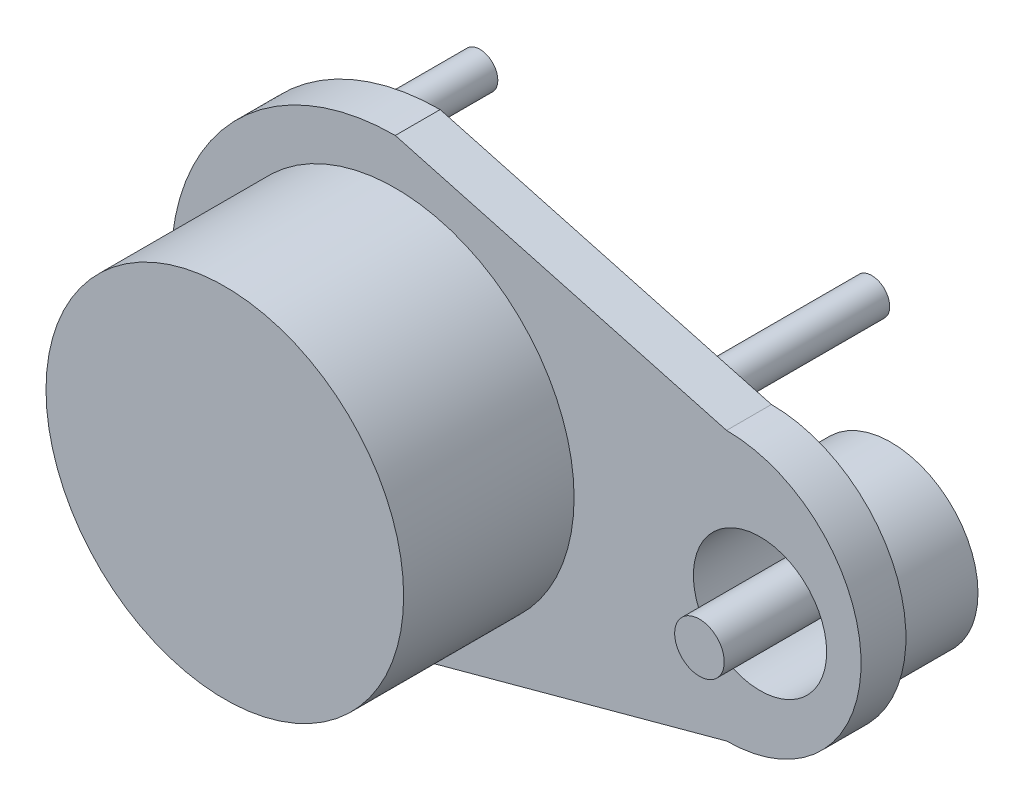
ISO-10303-21;
HEADER;
FILE_DESCRIPTION(('STEP AP214'),'2;1');
FILE_NAME('part.step','',(''),(''),'','','');
FILE_SCHEMA(('AUTOMOTIVE_DESIGN { 1 0 10303 214 1 1 1 1 }'));
ENDSEC;
DATA;
#1=APPLICATION_CONTEXT('core data for automotive mechanical design processes');
#2=APPLICATION_PROTOCOL_DEFINITION('international standard','automotive_design',2000,#1);
#3=PRODUCT_CONTEXT('',#1,'mechanical');
#4=PRODUCT('Part','Part','',(#3));
#5=PRODUCT_RELATED_PRODUCT_CATEGORY('part','',(#4));
#6=PRODUCT_DEFINITION_FORMATION('','',#4);
#7=PRODUCT_DEFINITION_CONTEXT('part definition',#1,'design');
#8=PRODUCT_DEFINITION('design','',#6,#7);
#9=PRODUCT_DEFINITION_SHAPE('','',#8);
#10=(LENGTH_UNIT() NAMED_UNIT(*) SI_UNIT(.MILLI.,.METRE.));
#11=(NAMED_UNIT(*) PLANE_ANGLE_UNIT() SI_UNIT($,.RADIAN.));
#12=(NAMED_UNIT(*) SI_UNIT($,.STERADIAN.) SOLID_ANGLE_UNIT());
#13=UNCERTAINTY_MEASURE_WITH_UNIT(LENGTH_MEASURE(1.E-05),#10,'distance_accuracy_value','');
#14=(GEOMETRIC_REPRESENTATION_CONTEXT(3) GLOBAL_UNCERTAINTY_ASSIGNED_CONTEXT((#13)) GLOBAL_UNIT_ASSIGNED_CONTEXT((#10,
#11,#12)) REPRESENTATION_CONTEXT('',''));
#15=CARTESIAN_POINT('',(0.,0.,0.));
#16=DIRECTION('',(0.,0.,1.));
#17=DIRECTION('',(1.,0.,0.));
#18=AXIS2_PLACEMENT_3D('',#15,#16,#17);
#19=CARTESIAN_POINT('',(6.13606220537989,-0.0739210601489247,1.8));
#20=DIRECTION('',(0.,0.,-1.));
#21=DIRECTION('',(-1.,0.,0.));
#22=AXIS2_PLACEMENT_3D('',#19,#20,#21);
#23=CYLINDRICAL_SURFACE('',#22,0.414358546564722);
#24=CARTESIAN_POINT('',(6.13606220537989,-0.0739210601489247,1.8));
#25=DIRECTION('',(0.,0.,-1.));
#26=DIRECTION('',(1.,0.,0.));
#27=AXIS2_PLACEMENT_3D('',#24,#25,#26);
#28=CIRCLE('',#27,0.414358546564722);
#29=CARTESIAN_POINT('',(6.55042075194461,-0.0739210601489247,1.8));
#30=VERTEX_POINT('',#29);
#31=EDGE_CURVE('E11',#30,#30,#28,.T.);
#32=ORIENTED_EDGE('',*,*,#31,.T.);
#33=EDGE_LOOP('',(#32));
#34=FACE_BOUND('',#33,.T.);
#35=CARTESIAN_POINT('',(6.13606220537989,-0.0739210601489247,0.));
#36=DIRECTION('',(0.,0.,-1.));
#37=DIRECTION('',(1.,0.,0.));
#38=AXIS2_PLACEMENT_3D('',#35,#36,#37);
#39=CIRCLE('',#38,0.414358546564722);
#40=CARTESIAN_POINT('',(6.55042075194461,-0.0739210601489247,0.));
#41=VERTEX_POINT('',#40);
#42=EDGE_CURVE('E50',#41,#41,#39,.T.);
#43=ORIENTED_EDGE('',*,*,#42,.F.);
#44=EDGE_LOOP('',(#43));
#45=FACE_BOUND('',#44,.T.);
#46=ADVANCED_FACE('F47',(#34,#45),#23,.T.);
#47=CARTESIAN_POINT('',(6.13606220537989,-0.0739210601489247,1.8));
#48=DIRECTION('',(0.,0.,1.));
#49=DIRECTION('',(1.,0.,0.));
#50=AXIS2_PLACEMENT_3D('',#47,#48,#49);
#51=PLANE('',#50);
#52=ORIENTED_EDGE('',*,*,#31,.F.);
#53=EDGE_LOOP('',(#52));
#54=FACE_BOUND('',#53,.T.);
#55=ADVANCED_FACE('F62',(#54),#51,.T.);
#56=CARTESIAN_POINT('',(6.13606220537989,-0.0739210601489247,0.));
#57=DIRECTION('',(0.,0.,1.));
#58=DIRECTION('',(1.,0.,0.));
#59=AXIS2_PLACEMENT_3D('',#56,#57,#58);
#60=PLANE('',#59);
#61=ORIENTED_EDGE('',*,*,#42,.T.);
#62=EDGE_LOOP('',(#61));
#63=FACE_BOUND('',#62,.T.);
#64=ADVANCED_FACE('F59',(#63),#60,.F.);
#65=CLOSED_SHELL('',(#46,#55,#64));
#66=MANIFOLD_SOLID_BREP('B2',#65);
#67=CARTESIAN_POINT('',(0.,0.,0.));
#68=DIRECTION('',(0.,0.,1.));
#69=DIRECTION('',(1.,0.,0.));
#70=AXIS2_PLACEMENT_3D('',#67,#68,#69);
#71=CYLINDRICAL_SURFACE('',#70,3.75);
#72=CARTESIAN_POINT('',(0.,0.,0.75));
#73=DIRECTION('',(0.,0.,1.));
#74=DIRECTION('',(1.,0.,0.));
#75=AXIS2_PLACEMENT_3D('',#72,#73,#74);
#76=CIRCLE('',#75,3.75);
#77=CARTESIAN_POINT('',(0.,3.75,0.75));
#78=VERTEX_POINT('',#77);
#79=CARTESIAN_POINT('',(0.,-3.75,0.75));
#80=VERTEX_POINT('',#79);
#81=EDGE_CURVE('E162',#78,#80,#76,.T.);
#82=ORIENTED_EDGE('',*,*,#81,.F.);
#83=DIRECTION('',(0.,0.,1.));
#84=VECTOR('',#83,1.);
#85=CARTESIAN_POINT('',(0.,3.75,0.));
#86=LINE('',#85,#84);
#87=CARTESIAN_POINT('',(0.,3.75,0.));
#88=VERTEX_POINT('',#87);
#89=EDGE_CURVE('E105',#88,#78,#86,.T.);
#90=ORIENTED_EDGE('',*,*,#89,.F.);
#91=CARTESIAN_POINT('',(0.,0.,0.));
#92=DIRECTION('',(0.,0.,1.));
#93=DIRECTION('',(1.,0.,0.));
#94=AXIS2_PLACEMENT_3D('',#91,#92,#93);
#95=CIRCLE('',#94,3.75);
#96=CARTESIAN_POINT('',(0.,-3.75,0.));
#97=VERTEX_POINT('',#96);
#98=EDGE_CURVE('E153',#88,#97,#95,.T.);
#99=ORIENTED_EDGE('',*,*,#98,.T.);
#100=DIRECTION('',(0.,0.,1.));
#101=VECTOR('',#100,1.);
#102=CARTESIAN_POINT('',(0.,-3.75,0.));
#103=LINE('',#102,#101);
#104=EDGE_CURVE('E133',#97,#80,#103,.T.);
#105=ORIENTED_EDGE('',*,*,#104,.T.);
#106=EDGE_LOOP('',(#82,#90,#99,#105));
#107=FACE_BOUND('',#106,.T.);
#108=ADVANCED_FACE('F88',(#107),#71,.T.);
#109=CARTESIAN_POINT('',(5.53928342735173,2.24917212989785,0.));
#110=DIRECTION('',(0.261513733941694,0.965199754952245,0.));
#111=DIRECTION('',(-0.965199754952245,0.261513733941694,0.));
#112=AXIS2_PLACEMENT_3D('',#109,#110,#111);
#113=PLANE('',#112);
#114=DIRECTION('',(-0.965199754952245,0.261513733941694,0.));
#115=VECTOR('',#114,1.);
#116=CARTESIAN_POINT('',(5.53928342735173,2.24917212989785,0.75));
#117=LINE('',#116,#115);
#118=CARTESIAN_POINT('',(5.53928342735173,2.24917212989785,0.75));
#119=VERTEX_POINT('',#118);
#120=EDGE_CURVE('E156',#119,#78,#117,.T.);
#121=ORIENTED_EDGE('',*,*,#120,.F.);
#122=DIRECTION('',(0.,0.,1.));
#123=VECTOR('',#122,1.);
#124=CARTESIAN_POINT('',(5.53928342735173,2.24917212989785,0.));
#125=LINE('',#124,#123);
#126=CARTESIAN_POINT('',(5.53928342735173,2.24917212989785,0.));
#127=VERTEX_POINT('',#126);
#128=EDGE_CURVE('E122',#127,#119,#125,.T.);
#129=ORIENTED_EDGE('',*,*,#128,.F.);
#130=DIRECTION('',(-0.965199754952245,0.261513733941694,0.));
#131=VECTOR('',#130,1.);
#132=CARTESIAN_POINT('',(5.53928342735173,2.24917212989785,0.));
#133=LINE('',#132,#131);
#134=EDGE_CURVE('E148',#127,#88,#133,.T.);
#135=ORIENTED_EDGE('',*,*,#134,.T.);
#136=ORIENTED_EDGE('',*,*,#89,.T.);
#137=EDGE_LOOP('',(#121,#129,#135,#136));
#138=FACE_BOUND('',#137,.T.);
#139=ADVANCED_FACE('F225',(#138),#113,.T.);
#140=CARTESIAN_POINT('',(5.53928342735173,0.,0.));
#141=DIRECTION('',(0.,0.,1.));
#142=DIRECTION('',(1.,0.,0.));
#143=AXIS2_PLACEMENT_3D('',#140,#141,#142);
#144=CYLINDRICAL_SURFACE('',#143,2.24917212989785);
#145=CARTESIAN_POINT('',(5.53928342735173,0.,0.75));
#146=DIRECTION('',(0.,0.,1.));
#147=DIRECTION('',(1.,0.,0.));
#148=AXIS2_PLACEMENT_3D('',#145,#146,#147);
#149=CIRCLE('',#148,2.24917212989785);
#150=CARTESIAN_POINT('',(5.53928342735173,-2.24917212989785,0.75));
#151=VERTEX_POINT('',#150);
#152=EDGE_CURVE('E141',#151,#119,#149,.T.);
#153=ORIENTED_EDGE('',*,*,#152,.F.);
#154=DIRECTION('',(0.,0.,1.));
#155=VECTOR('',#154,1.);
#156=CARTESIAN_POINT('',(5.53928342735173,-2.24917212989785,0.));
#157=LINE('',#156,#155);
#158=CARTESIAN_POINT('',(5.53928342735173,-2.24917212989785,0.));
#159=VERTEX_POINT('',#158);
#160=EDGE_CURVE('E136',#159,#151,#157,.T.);
#161=ORIENTED_EDGE('',*,*,#160,.F.);
#162=CARTESIAN_POINT('',(5.53928342735173,0.,0.));
#163=DIRECTION('',(0.,0.,1.));
#164=DIRECTION('',(1.,0.,0.));
#165=AXIS2_PLACEMENT_3D('',#162,#163,#164);
#166=CIRCLE('',#165,2.24917212989785);
#167=EDGE_CURVE('E139',#159,#127,#166,.T.);
#168=ORIENTED_EDGE('',*,*,#167,.T.);
#169=ORIENTED_EDGE('',*,*,#128,.T.);
#170=EDGE_LOOP('',(#153,#161,#168,#169));
#171=FACE_BOUND('',#170,.T.);
#172=ADVANCED_FACE('F138',(#171),#144,.T.);
#173=CARTESIAN_POINT('',(0.,-3.75,0.));
#174=DIRECTION('',(0.261513733941694,-0.965199754952245,0.));
#175=DIRECTION('',(0.965199754952245,0.261513733941694,0.));
#176=AXIS2_PLACEMENT_3D('',#173,#174,#175);
#177=PLANE('',#176);
#178=DIRECTION('',(0.965199754952245,0.261513733941694,0.));
#179=VECTOR('',#178,1.);
#180=CARTESIAN_POINT('',(0.,-3.75,0.75));
#181=LINE('',#180,#179);
#182=EDGE_CURVE('E166',#80,#151,#181,.T.);
#183=ORIENTED_EDGE('',*,*,#182,.F.);
#184=ORIENTED_EDGE('',*,*,#104,.F.);
#185=DIRECTION('',(0.965199754952245,0.261513733941694,0.));
#186=VECTOR('',#185,1.);
#187=CARTESIAN_POINT('',(0.,-3.75,0.));
#188=LINE('',#187,#186);
#189=EDGE_CURVE('E147',#97,#159,#188,.T.);
#190=ORIENTED_EDGE('',*,*,#189,.T.);
#191=ORIENTED_EDGE('',*,*,#160,.T.);
#192=EDGE_LOOP('',(#183,#184,#190,#191));
#193=FACE_BOUND('',#192,.T.);
#194=ADVANCED_FACE('F151',(#193),#177,.T.);
#195=CARTESIAN_POINT('',(0.,0.,0.));
#196=DIRECTION('',(0.,0.,1.));
#197=DIRECTION('',(1.,0.,0.));
#198=AXIS2_PLACEMENT_3D('',#195,#196,#197);
#199=PLANE('',#198);
#200=CARTESIAN_POINT('',(-2.33550033845928,1.65606157665012,0.));
#201=DIRECTION('',(0.,0.,1.));
#202=DIRECTION('',(1.,0.,0.));
#203=AXIS2_PLACEMENT_3D('',#200,#201,#202);
#204=CIRCLE('',#203,0.3);
#205=CARTESIAN_POINT('',(-2.03550033845928,1.65606157665012,0.));
#206=VERTEX_POINT('',#205);
#207=EDGE_CURVE('E45',#206,#206,#204,.F.);
#208=ORIENTED_EDGE('',*,*,#207,.F.);
#209=EDGE_LOOP('',(#208));
#210=FACE_BOUND('',#209,.T.);
#211=CARTESIAN_POINT('',(4.21700322835852,1.65606157665012,0.));
#212=DIRECTION('',(0.,0.,1.));
#213=DIRECTION('',(1.,0.,0.));
#214=AXIS2_PLACEMENT_3D('',#211,#212,#213);
#215=CIRCLE('',#214,0.3);
#216=CARTESIAN_POINT('',(4.51700322835852,1.65606157665012,0.));
#217=VERTEX_POINT('',#216);
#218=EDGE_CURVE('E97',#217,#217,#215,.F.);
#219=ORIENTED_EDGE('',*,*,#218,.F.);
#220=EDGE_LOOP('',(#219));
#221=FACE_BOUND('',#220,.T.);
#222=CARTESIAN_POINT('',(-2.32214505937726,-1.19392531452417,0.));
#223=DIRECTION('',(0.,0.,1.));
#224=DIRECTION('',(1.,0.,0.));
#225=AXIS2_PLACEMENT_3D('',#222,#223,#224);
#226=CIRCLE('',#225,0.3);
#227=CARTESIAN_POINT('',(-2.02214505937726,-1.19392531452417,0.));
#228=VERTEX_POINT('',#227);
#229=EDGE_CURVE('E189',#228,#228,#226,.F.);
#230=ORIENTED_EDGE('',*,*,#229,.F.);
#231=EDGE_LOOP('',(#230));
#232=FACE_BOUND('',#231,.T.);
#233=CARTESIAN_POINT('',(4.19412788257281,-1.19392531452417,0.));
#234=DIRECTION('',(0.,0.,1.));
#235=DIRECTION('',(1.,0.,0.));
#236=AXIS2_PLACEMENT_3D('',#233,#234,#235);
#237=CIRCLE('',#236,0.3);
#238=CARTESIAN_POINT('',(4.49412788257281,-1.19392531452417,0.));
#239=VERTEX_POINT('',#238);
#240=EDGE_CURVE('E185',#239,#239,#237,.F.);
#241=ORIENTED_EDGE('',*,*,#240,.F.);
#242=EDGE_LOOP('',(#241));
#243=FACE_BOUND('',#242,.T.);
#244=CARTESIAN_POINT('',(6.18990300181641,-0.101269822445856,0.));
#245=DIRECTION('',(0.,0.,1.));
#246=DIRECTION('',(1.,0.,0.));
#247=AXIS2_PLACEMENT_3D('',#244,#245,#246);
#248=CIRCLE('',#247,1.45351980451713);
#249=CARTESIAN_POINT('',(7.64342280633354,-0.101269822445856,0.));
#250=VERTEX_POINT('',#249);
#251=EDGE_CURVE('E177',#250,#250,#248,.F.);
#252=ORIENTED_EDGE('',*,*,#251,.F.);
#253=EDGE_LOOP('',(#252));
#254=FACE_BOUND('',#253,.T.);
#255=ORIENTED_EDGE('',*,*,#98,.F.);
#256=ORIENTED_EDGE('',*,*,#134,.F.);
#257=ORIENTED_EDGE('',*,*,#167,.F.);
#258=ORIENTED_EDGE('',*,*,#189,.F.);
#259=EDGE_LOOP('',(#255,#256,#257,#258));
#260=FACE_BOUND('',#259,.T.);
#261=ADVANCED_FACE('F146',(#210,#221,#232,#243,#254,#260),#199,.F.);
#262=CARTESIAN_POINT('',(0.,0.,0.75));
#263=DIRECTION('',(0.,0.,1.));
#264=DIRECTION('',(1.,0.,0.));
#265=AXIS2_PLACEMENT_3D('',#262,#263,#264);
#266=PLANE('',#265);
#267=CARTESIAN_POINT('',(0.,0.,0.75));
#268=DIRECTION('',(0.,0.,-1.));
#269=DIRECTION('',(-1.,0.,0.));
#270=AXIS2_PLACEMENT_3D('',#267,#268,#269);
#271=CIRCLE('',#270,2.98996803252256);
#272=CARTESIAN_POINT('',(-2.98996803252256,0.,0.75));
#273=VERTEX_POINT('',#272);
#274=EDGE_CURVE('E351',#273,#273,#271,.T.);
#275=ORIENTED_EDGE('',*,*,#274,.T.);
#276=EDGE_LOOP('',(#275));
#277=FACE_BOUND('',#276,.T.);
#278=CARTESIAN_POINT('',(6.0987585846147,-0.125150984462153,0.750000000000001));
#279=DIRECTION('',(0.,0.,1.));
#280=DIRECTION('',(1.,0.,0.));
#281=AXIS2_PLACEMENT_3D('',#278,#279,#280);
#282=CIRCLE('',#281,1.11410504022745);
#283=CARTESIAN_POINT('',(7.21286362484215,-0.125150984462153,0.750000000000001));
#284=VERTEX_POINT('',#283);
#285=EDGE_CURVE('E321',#284,#284,#282,.T.);
#286=ORIENTED_EDGE('',*,*,#285,.F.);
#287=EDGE_LOOP('',(#286));
#288=FACE_BOUND('',#287,.T.);
#289=ORIENTED_EDGE('',*,*,#81,.T.);
#290=ORIENTED_EDGE('',*,*,#182,.T.);
#291=ORIENTED_EDGE('',*,*,#152,.T.);
#292=ORIENTED_EDGE('',*,*,#120,.T.);
#293=EDGE_LOOP('',(#289,#290,#291,#292));
#294=FACE_BOUND('',#293,.T.);
#295=ADVANCED_FACE('F200',(#277,#288,#294),#266,.T.);
#296=CARTESIAN_POINT('',(6.18990300181641,-0.101269822445856,-1.35));
#297=DIRECTION('',(0.,0.,1.));
#298=DIRECTION('',(1.,0.,0.));
#299=AXIS2_PLACEMENT_3D('',#296,#297,#298);
#300=CYLINDRICAL_SURFACE('',#299,1.45351980451713);
#301=CARTESIAN_POINT('',(6.18990300181641,-0.101269822445856,-1.35));
#302=DIRECTION('',(0.,0.,-1.));
#303=DIRECTION('',(-1.,0.,0.));
#304=AXIS2_PLACEMENT_3D('',#301,#302,#303);
#305=CIRCLE('',#304,1.45351980451713);
#306=CARTESIAN_POINT('',(7.64342280633354,-0.101269822445856,-1.35));
#307=VERTEX_POINT('',#306);
#308=EDGE_CURVE('E167',#307,#307,#305,.T.);
#309=CARTESIAN_POINT('',(7.64342280633354,-0.101269822445856,-1.35));
#310=CARTESIAN_POINT('',(7.64342280633354,-0.101269822445856,-1.3359375));
#311=CARTESIAN_POINT('',(7.64342280633354,-0.101269822445856,-1.321875));
#312=CARTESIAN_POINT('',(7.64342280633354,-0.101269822445856,-1.29375));
#313=CARTESIAN_POINT('',(7.64342280633354,-0.101269822445856,-1.2796875));
#314=CARTESIAN_POINT('',(7.64342280633354,-0.101269822445856,-1.2515625));
#315=CARTESIAN_POINT('',(7.64342280633354,-0.101269822445856,-1.2375));
#316=CARTESIAN_POINT('',(7.64342280633354,-0.101269822445856,-1.209375));
#317=CARTESIAN_POINT('',(7.64342280633354,-0.101269822445856,-1.1953125));
#318=CARTESIAN_POINT('',(7.64342280633354,-0.101269822445856,-1.1671875));
#319=CARTESIAN_POINT('',(7.64342280633354,-0.101269822445856,-1.153125));
#320=CARTESIAN_POINT('',(7.64342280633354,-0.101269822445856,-1.125));
#321=CARTESIAN_POINT('',(7.64342280633354,-0.101269822445856,-1.1109375));
#322=CARTESIAN_POINT('',(7.64342280633354,-0.101269822445856,-1.0828125));
#323=CARTESIAN_POINT('',(7.64342280633354,-0.101269822445856,-1.06875));
#324=CARTESIAN_POINT('',(7.64342280633354,-0.101269822445856,-1.040625));
#325=CARTESIAN_POINT('',(7.64342280633354,-0.101269822445856,-1.0265625));
#326=CARTESIAN_POINT('',(7.64342280633354,-0.101269822445856,-0.9984375));
#327=CARTESIAN_POINT('',(7.64342280633354,-0.101269822445856,-0.984375));
#328=CARTESIAN_POINT('',(7.64342280633354,-0.101269822445856,-0.95625));
#329=CARTESIAN_POINT('',(7.64342280633354,-0.101269822445856,-0.9421875));
#330=CARTESIAN_POINT('',(7.64342280633354,-0.101269822445856,-0.9140625));
#331=CARTESIAN_POINT('',(7.64342280633354,-0.101269822445856,-0.9));
#332=CARTESIAN_POINT('',(7.64342280633354,-0.101269822445856,-0.871875));
#333=CARTESIAN_POINT('',(7.64342280633354,-0.101269822445856,-0.8578125));
#334=CARTESIAN_POINT('',(7.64342280633354,-0.101269822445856,-0.8296875));
#335=CARTESIAN_POINT('',(7.64342280633354,-0.101269822445856,-0.815625));
#336=CARTESIAN_POINT('',(7.64342280633354,-0.101269822445856,-0.7875));
#337=CARTESIAN_POINT('',(7.64342280633354,-0.101269822445856,-0.7734375));
#338=CARTESIAN_POINT('',(7.64342280633354,-0.101269822445856,-0.7453125));
#339=CARTESIAN_POINT('',(7.64342280633354,-0.101269822445856,-0.73125));
#340=CARTESIAN_POINT('',(7.64342280633354,-0.101269822445856,-0.703125));
#341=CARTESIAN_POINT('',(7.64342280633354,-0.101269822445856,-0.6890625));
#342=CARTESIAN_POINT('',(7.64342280633354,-0.101269822445856,-0.6609375));
#343=CARTESIAN_POINT('',(7.64342280633354,-0.101269822445856,-0.646875));
#344=CARTESIAN_POINT('',(7.64342280633354,-0.101269822445856,-0.61875));
#345=CARTESIAN_POINT('',(7.64342280633354,-0.101269822445856,-0.6046875));
#346=CARTESIAN_POINT('',(7.64342280633354,-0.101269822445856,-0.5765625));
#347=CARTESIAN_POINT('',(7.64342280633354,-0.101269822445856,-0.5625));
#348=CARTESIAN_POINT('',(7.64342280633354,-0.101269822445856,-0.534375));
#349=CARTESIAN_POINT('',(7.64342280633354,-0.101269822445856,-0.5203125));
#350=CARTESIAN_POINT('',(7.64342280633354,-0.101269822445856,-0.4921875));
#351=CARTESIAN_POINT('',(7.64342280633354,-0.101269822445856,-0.478125));
#352=CARTESIAN_POINT('',(7.64342280633354,-0.101269822445856,-0.45));
#353=CARTESIAN_POINT('',(7.64342280633354,-0.101269822445856,-0.4359375));
#354=CARTESIAN_POINT('',(7.64342280633354,-0.101269822445856,-0.4078125));
#355=CARTESIAN_POINT('',(7.64342280633354,-0.101269822445856,-0.39375));
#356=CARTESIAN_POINT('',(7.64342280633354,-0.101269822445856,-0.365625));
#357=CARTESIAN_POINT('',(7.64342280633354,-0.101269822445856,-0.3515625));
#358=CARTESIAN_POINT('',(7.64342280633354,-0.101269822445856,-0.3234375));
#359=CARTESIAN_POINT('',(7.64342280633354,-0.101269822445856,-0.309375));
#360=CARTESIAN_POINT('',(7.64342280633354,-0.101269822445856,-0.28125));
#361=CARTESIAN_POINT('',(7.64342280633354,-0.101269822445856,-0.2671875));
#362=CARTESIAN_POINT('',(7.64342280633354,-0.101269822445856,-0.2390625));
#363=CARTESIAN_POINT('',(7.64342280633354,-0.101269822445856,-0.225));
#364=CARTESIAN_POINT('',(7.64342280633354,-0.101269822445856,-0.196875));
#365=CARTESIAN_POINT('',(7.64342280633354,-0.101269822445856,-0.1828125));
#366=CARTESIAN_POINT('',(7.64342280633354,-0.101269822445856,-0.1546875));
#367=CARTESIAN_POINT('',(7.64342280633354,-0.101269822445856,-0.140625));
#368=CARTESIAN_POINT('',(7.64342280633354,-0.101269822445856,-0.1125));
#369=CARTESIAN_POINT('',(7.64342280633354,-0.101269822445856,-0.0984375000000002));
#370=CARTESIAN_POINT('',(7.64342280633354,-0.101269822445856,-0.0703125000000002));
#371=CARTESIAN_POINT('',(7.64342280633354,-0.101269822445856,-0.0562500000000002));
#372=CARTESIAN_POINT('',(7.64342280633354,-0.101269822445856,-0.0281250000000002));
#373=CARTESIAN_POINT('',(7.64342280633354,-0.101269822445856,-0.0140625000000002));
#374=CARTESIAN_POINT('',(7.64342280633354,-0.101269822445856,0.));
#375=B_SPLINE_CURVE_WITH_KNOTS('',3,(#309,#310,#311,#312,#313,#314,#315,#316,#317,#318,#319,
#320,#321,#322,#323,#324,#325,#326,#327,#328,#329,#330,#331,#332,#333,#334,#335,#336,#337,#338,
#339,#340,#341,#342,#343,#344,#345,#346,#347,#348,#349,#350,#351,#352,#353,#354,#355,#356,#357,
#358,#359,#360,#361,#362,#363,#364,#365,#366,#367,#368,#369,#370,#371,#372,#373,#374),
.UNSPECIFIED.,.F.,.F.,(4,2,2,2,2,2,2,2,2,2,2,2,2,2,2,2,2,2,2,2,2,2,2,2,2,2,2,2,2,2,2,2,4),(0.,
0.0421874999999999,0.0843749999999998,0.1265625,0.16875,0.2109375,0.253125,0.2953125,0.3375,
0.3796875,0.421875,0.4640625,0.50625,0.5484375,0.590625,0.6328125,0.675,0.7171875,0.759375,
0.8015625,0.84375,0.8859375,0.928125,0.9703125,1.0125,1.0546875,1.096875,1.1390625,1.18125,
1.2234375,1.265625,1.3078125,1.35),.UNSPECIFIED.);
#376=EDGE_CURVE('BSEAM209',#307,#250,#375,.T.);
#377=ORIENTED_EDGE('',*,*,#308,.F.);
#378=ORIENTED_EDGE('',*,*,#251,.T.);
#379=ORIENTED_EDGE('',*,*,#376,.T.);
#380=ORIENTED_EDGE('',*,*,#376,.F.);
#381=EDGE_LOOP('',(#377,#379,#378,#380));
#382=FACE_BOUND('',#381,.T.);
#383=ADVANCED_FACE('F209',(#382),#300,.T.);
#384=CARTESIAN_POINT('',(6.18990300181641,-0.101269822445856,-1.35));
#385=DIRECTION('',(0.,0.,-1.));
#386=DIRECTION('',(-1.,0.,0.));
#387=AXIS2_PLACEMENT_3D('',#384,#385,#386);
#388=PLANE('',#387);
#389=CARTESIAN_POINT('',(6.0987585846147,-0.125150984462153,-1.35));
#390=DIRECTION('',(0.,0.,1.));
#391=DIRECTION('',(1.,0.,0.));
#392=AXIS2_PLACEMENT_3D('',#389,#390,#391);
#393=CIRCLE('',#392,1.11410504022745);
#394=CARTESIAN_POINT('',(7.21286362484215,-0.125150984462153,-1.35));
#395=VERTEX_POINT('',#394);
#396=EDGE_CURVE('E318',#395,#395,#393,.T.);
#397=ORIENTED_EDGE('',*,*,#396,.T.);
#398=EDGE_LOOP('',(#397));
#399=FACE_BOUND('',#398,.T.);
#400=ORIENTED_EDGE('',*,*,#308,.T.);
#401=EDGE_LOOP('',(#400));
#402=FACE_BOUND('',#401,.T.);
#403=ADVANCED_FACE('F211',(#399,#402),#388,.T.);
#404=CARTESIAN_POINT('',(6.0987585846147,-0.125150984462153,0.75));
#405=DIRECTION('',(0.,0.,1.));
#406=DIRECTION('',(1.,0.,0.));
#407=AXIS2_PLACEMENT_3D('',#404,#405,#406);
#408=CYLINDRICAL_SURFACE('',#407,1.11410504022745);
#409=ORIENTED_EDGE('',*,*,#396,.F.);
#410=EDGE_LOOP('',(#409));
#411=FACE_BOUND('',#410,.T.);
#412=ORIENTED_EDGE('',*,*,#285,.T.);
#413=EDGE_LOOP('',(#412));
#414=FACE_BOUND('',#413,.T.);
#415=ADVANCED_FACE('F218',(#411,#414),#408,.F.);
#416=CARTESIAN_POINT('',(4.19412788257281,-1.19392531452417,-3.));
#417=DIRECTION('',(0.,0.,1.));
#418=DIRECTION('',(1.,0.,0.));
#419=AXIS2_PLACEMENT_3D('',#416,#417,#418);
#420=CYLINDRICAL_SURFACE('',#419,0.3);
#421=CARTESIAN_POINT('',(4.19412788257281,-1.19392531452417,-3.));
#422=DIRECTION('',(0.,0.,-1.));
#423=DIRECTION('',(-1.,0.,0.));
#424=AXIS2_PLACEMENT_3D('',#421,#422,#423);
#425=CIRCLE('',#424,0.3);
#426=CARTESIAN_POINT('',(3.89412788257281,-1.19392531452417,-3.));
#427=VERTEX_POINT('',#426);
#428=EDGE_CURVE('E324',#427,#427,#425,.T.);
#429=ORIENTED_EDGE('',*,*,#428,.F.);
#430=EDGE_LOOP('',(#429));
#431=FACE_BOUND('',#430,.T.);
#432=ORIENTED_EDGE('',*,*,#240,.T.);
#433=EDGE_LOOP('',(#432));
#434=FACE_BOUND('',#433,.T.);
#435=ADVANCED_FACE('F306',(#431,#434),#420,.T.);
#436=CARTESIAN_POINT('',(4.19412788257281,-1.19392531452417,-3.));
#437=DIRECTION('',(0.,0.,-1.));
#438=DIRECTION('',(-1.,0.,0.));
#439=AXIS2_PLACEMENT_3D('',#436,#437,#438);
#440=PLANE('',#439);
#441=ORIENTED_EDGE('',*,*,#428,.T.);
#442=EDGE_LOOP('',(#441));
#443=FACE_BOUND('',#442,.T.);
#444=ADVANCED_FACE('F302',(#443),#440,.T.);
#445=CARTESIAN_POINT('',(-2.32214505937726,-1.19392531452417,-3.));
#446=DIRECTION('',(0.,0.,1.));
#447=DIRECTION('',(1.,0.,0.));
#448=AXIS2_PLACEMENT_3D('',#445,#446,#447);
#449=CYLINDRICAL_SURFACE('',#448,0.3);
#450=CARTESIAN_POINT('',(-2.32214505937726,-1.19392531452417,-3.));
#451=DIRECTION('',(0.,0.,-1.));
#452=DIRECTION('',(-1.,0.,0.));
#453=AXIS2_PLACEMENT_3D('',#450,#451,#452);
#454=CIRCLE('',#453,0.3);
#455=CARTESIAN_POINT('',(-2.62214505937726,-1.19392531452417,-3.));
#456=VERTEX_POINT('',#455);
#457=EDGE_CURVE('E330',#456,#456,#454,.T.);
#458=ORIENTED_EDGE('',*,*,#457,.F.);
#459=EDGE_LOOP('',(#458));
#460=FACE_BOUND('',#459,.T.);
#461=ORIENTED_EDGE('',*,*,#229,.T.);
#462=EDGE_LOOP('',(#461));
#463=FACE_BOUND('',#462,.T.);
#464=ADVANCED_FACE('F298',(#460,#463),#449,.T.);
#465=CARTESIAN_POINT('',(-2.32214505937726,-1.19392531452417,-3.));
#466=DIRECTION('',(0.,0.,-1.));
#467=DIRECTION('',(-1.,0.,0.));
#468=AXIS2_PLACEMENT_3D('',#465,#466,#467);
#469=PLANE('',#468);
#470=ORIENTED_EDGE('',*,*,#457,.T.);
#471=EDGE_LOOP('',(#470));
#472=FACE_BOUND('',#471,.T.);
#473=ADVANCED_FACE('F294',(#472),#469,.T.);
#474=CARTESIAN_POINT('',(4.21700322835852,1.65606157665012,-3.));
#475=DIRECTION('',(0.,0.,1.));
#476=DIRECTION('',(1.,0.,0.));
#477=AXIS2_PLACEMENT_3D('',#474,#475,#476);
#478=CYLINDRICAL_SURFACE('',#477,0.3);
#479=CARTESIAN_POINT('',(4.21700322835852,1.65606157665012,-3.));
#480=DIRECTION('',(0.,0.,-1.));
#481=DIRECTION('',(-1.,0.,0.));
#482=AXIS2_PLACEMENT_3D('',#479,#480,#481);
#483=CIRCLE('',#482,0.3);
#484=CARTESIAN_POINT('',(3.91700322835852,1.65606157665012,-3.));
#485=VERTEX_POINT('',#484);
#486=EDGE_CURVE('E339',#485,#485,#483,.T.);
#487=ORIENTED_EDGE('',*,*,#486,.F.);
#488=EDGE_LOOP('',(#487));
#489=FACE_BOUND('',#488,.T.);
#490=ORIENTED_EDGE('',*,*,#218,.T.);
#491=EDGE_LOOP('',(#490));
#492=FACE_BOUND('',#491,.T.);
#493=ADVANCED_FACE('F196',(#489,#492),#478,.T.);
#494=CARTESIAN_POINT('',(4.21700322835852,1.65606157665012,-3.));
#495=DIRECTION('',(0.,0.,-1.));
#496=DIRECTION('',(-1.,0.,0.));
#497=AXIS2_PLACEMENT_3D('',#494,#495,#496);
#498=PLANE('',#497);
#499=ORIENTED_EDGE('',*,*,#486,.T.);
#500=EDGE_LOOP('',(#499));
#501=FACE_BOUND('',#500,.T.);
#502=ADVANCED_FACE('F287',(#501),#498,.T.);
#503=CARTESIAN_POINT('',(-2.33550033845928,1.65606157665012,-3.));
#504=DIRECTION('',(0.,0.,1.));
#505=DIRECTION('',(1.,0.,0.));
#506=AXIS2_PLACEMENT_3D('',#503,#504,#505);
#507=CYLINDRICAL_SURFACE('',#506,0.3);
#508=CARTESIAN_POINT('',(-2.33550033845928,1.65606157665012,-3.));
#509=DIRECTION('',(0.,0.,-1.));
#510=DIRECTION('',(-1.,0.,0.));
#511=AXIS2_PLACEMENT_3D('',#508,#509,#510);
#512=CIRCLE('',#511,0.3);
#513=CARTESIAN_POINT('',(-2.63550033845928,1.65606157665012,-3.));
#514=VERTEX_POINT('',#513);
#515=EDGE_CURVE('E343',#514,#514,#512,.T.);
#516=ORIENTED_EDGE('',*,*,#515,.F.);
#517=EDGE_LOOP('',(#516));
#518=FACE_BOUND('',#517,.T.);
#519=ORIENTED_EDGE('',*,*,#207,.T.);
#520=EDGE_LOOP('',(#519));
#521=FACE_BOUND('',#520,.T.);
#522=ADVANCED_FACE('F283',(#518,#521),#507,.T.);
#523=CARTESIAN_POINT('',(-2.33550033845928,1.65606157665012,-3.));
#524=DIRECTION('',(0.,0.,-1.));
#525=DIRECTION('',(-1.,0.,0.));
#526=AXIS2_PLACEMENT_3D('',#523,#524,#525);
#527=PLANE('',#526);
#528=ORIENTED_EDGE('',*,*,#515,.T.);
#529=EDGE_LOOP('',(#528));
#530=FACE_BOUND('',#529,.T.);
#531=ADVANCED_FACE('F257',(#530),#527,.T.);
#532=CARTESIAN_POINT('',(0.,0.,3.6));
#533=DIRECTION('',(0.,0.,-1.));
#534=DIRECTION('',(-1.,0.,0.));
#535=AXIS2_PLACEMENT_3D('',#532,#533,#534);
#536=CYLINDRICAL_SURFACE('',#535,2.98996803252256);
#537=CARTESIAN_POINT('',(0.,0.,3.6));
#538=DIRECTION('',(0.,0.,-1.));
#539=DIRECTION('',(-1.,0.,0.));
#540=AXIS2_PLACEMENT_3D('',#537,#538,#539);
#541=CIRCLE('',#540,2.98996803252256);
#542=CARTESIAN_POINT('',(-2.98996803252256,0.,3.6));
#543=VERTEX_POINT('',#542);
#544=EDGE_CURVE('E347',#543,#543,#541,.T.);
#545=ORIENTED_EDGE('',*,*,#544,.T.);
#546=EDGE_LOOP('',(#545));
#547=FACE_BOUND('',#546,.T.);
#548=ORIENTED_EDGE('',*,*,#274,.F.);
#549=EDGE_LOOP('',(#548));
#550=FACE_BOUND('',#549,.T.);
#551=ADVANCED_FACE('F261',(#547,#550),#536,.T.);
#552=CARTESIAN_POINT('',(2.98996803252256,0.,3.6));
#553=DIRECTION('',(0.,0.,1.));
#554=DIRECTION('',(1.,0.,0.));
#555=AXIS2_PLACEMENT_3D('',#552,#553,#554);
#556=PLANE('',#555);
#557=ORIENTED_EDGE('',*,*,#544,.F.);
#558=EDGE_LOOP('',(#557));
#559=FACE_BOUND('',#558,.T.);
#560=ADVANCED_FACE('F266',(#559),#556,.T.);
#561=CLOSED_SHELL('',(#108,#139,#172,#194,#261,#295,#383,#403,#415,#435,#444,#464,#473,#493,
#502,#522,#531,#551,#560));
#562=MANIFOLD_SOLID_BREP('B6',#561);
#563=ADVANCED_BREP_SHAPE_REPRESENTATION('',(#18,#66,#562),#14);
#564=SHAPE_DEFINITION_REPRESENTATION(#9,#563);
ENDSEC;
END-ISO-10303-21;
